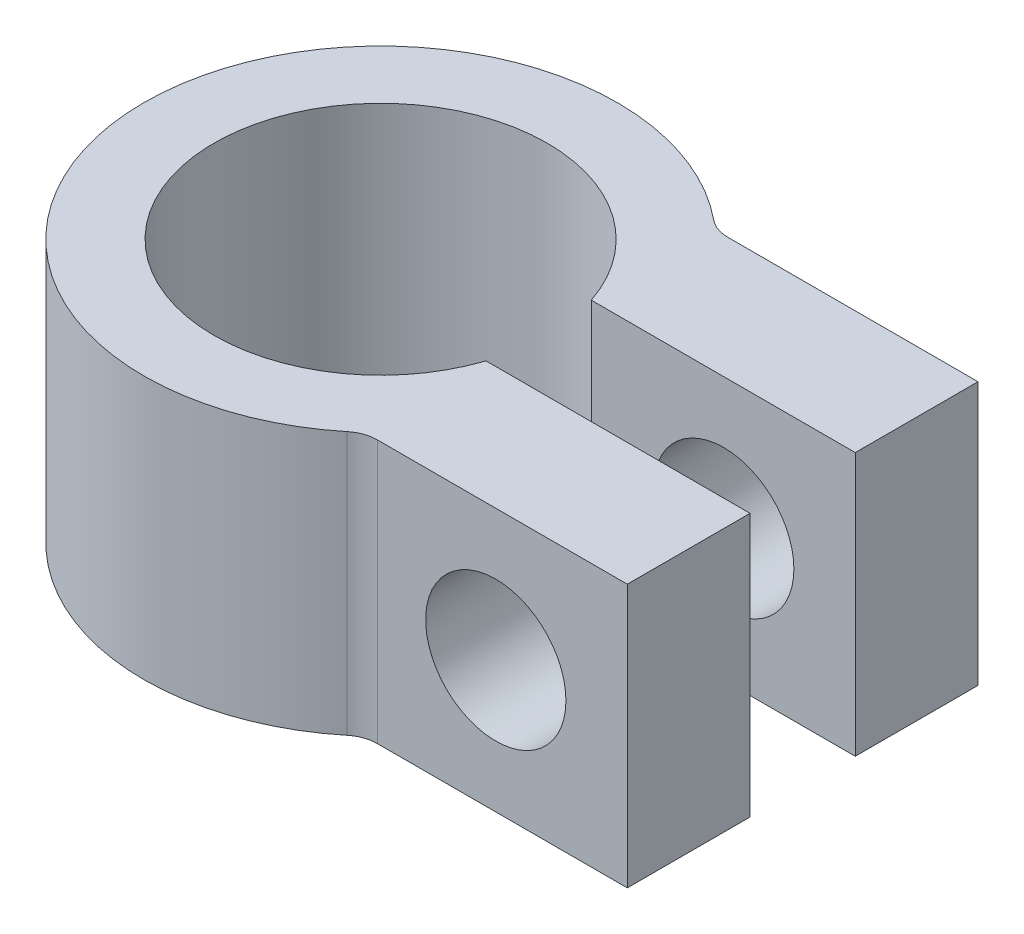
ISO-10303-21;
HEADER;
FILE_DESCRIPTION(('STEP AP214'),'2;1');
FILE_NAME('part.step','',(''),(''),'','','');
FILE_SCHEMA(('AUTOMOTIVE_DESIGN { 1 0 10303 214 1 1 1 1 }'));
ENDSEC;
DATA;
#1=APPLICATION_CONTEXT('core data for automotive mechanical design processes');
#2=APPLICATION_PROTOCOL_DEFINITION('international standard','automotive_design',2000,#1);
#3=PRODUCT_CONTEXT('',#1,'mechanical');
#4=PRODUCT('Part','Part','',(#3));
#5=PRODUCT_RELATED_PRODUCT_CATEGORY('part','',(#4));
#6=PRODUCT_DEFINITION_FORMATION('','',#4);
#7=PRODUCT_DEFINITION_CONTEXT('part definition',#1,'design');
#8=PRODUCT_DEFINITION('design','',#6,#7);
#9=PRODUCT_DEFINITION_SHAPE('','',#8);
#10=(LENGTH_UNIT() NAMED_UNIT(*) SI_UNIT(.MILLI.,.METRE.));
#11=(NAMED_UNIT(*) PLANE_ANGLE_UNIT() SI_UNIT($,.RADIAN.));
#12=(NAMED_UNIT(*) SI_UNIT($,.STERADIAN.) SOLID_ANGLE_UNIT());
#13=UNCERTAINTY_MEASURE_WITH_UNIT(LENGTH_MEASURE(1.E-05),#10,'distance_accuracy_value','');
#14=(GEOMETRIC_REPRESENTATION_CONTEXT(3) GLOBAL_UNCERTAINTY_ASSIGNED_CONTEXT((#13)) GLOBAL_UNIT_ASSIGNED_CONTEXT((#10,
#11,#12)) REPRESENTATION_CONTEXT('',''));
#15=CARTESIAN_POINT('',(0.,0.,0.));
#16=DIRECTION('',(0.,0.,1.));
#17=DIRECTION('',(1.,0.,0.));
#18=AXIS2_PLACEMENT_3D('',#15,#16,#17);
#19=CARTESIAN_POINT('',(0.,15.,0.));
#20=DIRECTION('',(0.,-1.,0.));
#21=DIRECTION('',(0.,0.,-1.));
#22=AXIS2_PLACEMENT_3D('',#19,#20,#21);
#23=CYLINDRICAL_SURFACE('',#22,13.5);
#24=CARTESIAN_POINT('',(0.,15.,0.));
#25=DIRECTION('',(0.,1.,0.));
#26=DIRECTION('',(0.,0.,1.));
#27=AXIS2_PLACEMENT_3D('',#24,#25,#26);
#28=CIRCLE('',#27,13.5);
#29=CARTESIAN_POINT('',(8.54481057257116,15.,-10.4516129032258));
#30=VERTEX_POINT('',#29);
#31=CARTESIAN_POINT('',(8.54481057257116,15.,10.4516129032258));
#32=VERTEX_POINT('',#31);
#33=EDGE_CURVE('E138',#30,#32,#28,.T.);
#34=ORIENTED_EDGE('',*,*,#33,.F.);
#35=DIRECTION('',(0.,-1.,0.));
#36=VECTOR('',#35,1.);
#37=CARTESIAN_POINT('',(8.54481057257116,15.,-10.4516129032258));
#38=LINE('',#37,#36);
#39=CARTESIAN_POINT('',(8.54481057257116,0.,-10.4516129032258));
#40=VERTEX_POINT('',#39);
#41=EDGE_CURVE('E163',#30,#40,#38,.T.);
#42=ORIENTED_EDGE('',*,*,#41,.T.);
#43=CARTESIAN_POINT('',(0.,0.,0.));
#44=DIRECTION('',(0.,1.,0.));
#45=DIRECTION('',(0.,0.,1.));
#46=AXIS2_PLACEMENT_3D('',#43,#44,#45);
#47=CIRCLE('',#46,13.5);
#48=CARTESIAN_POINT('',(8.54481057257116,0.,10.4516129032258));
#49=VERTEX_POINT('',#48);
#50=EDGE_CURVE('E135',#40,#49,#47,.T.);
#51=ORIENTED_EDGE('',*,*,#50,.T.);
#52=DIRECTION('',(0.,-1.,0.));
#53=VECTOR('',#52,1.);
#54=CARTESIAN_POINT('',(8.54481057257116,15.,10.4516129032258));
#55=LINE('',#54,#53);
#56=EDGE_CURVE('E155',#49,#32,#55,.F.);
#57=ORIENTED_EDGE('',*,*,#56,.T.);
#58=EDGE_LOOP('',(#34,#42,#51,#57));
#59=FACE_BOUND('',#58,.T.);
#60=ADVANCED_FACE('F32',(#59),#23,.T.);
#61=CARTESIAN_POINT('',(0.,15.,0.));
#62=DIRECTION('',(0.,1.,0.));
#63=DIRECTION('',(0.,0.,1.));
#64=AXIS2_PLACEMENT_3D('',#61,#62,#63);
#65=PLANE('',#64);
#66=CARTESIAN_POINT('',(0.,15.,0.));
#67=DIRECTION('',(0.,1.,0.));
#68=DIRECTION('',(0.,0.,1.));
#69=AXIS2_PLACEMENT_3D('',#66,#67,#68);
#70=CIRCLE('',#69,9.5);
#71=CARTESIAN_POINT('',(9.01387818865997,15.,-3.));
#72=VERTEX_POINT('',#71);
#73=CARTESIAN_POINT('',(9.01387818865997,15.,3.));
#74=VERTEX_POINT('',#73);
#75=EDGE_CURVE('E113',#72,#74,#70,.T.);
#76=ORIENTED_EDGE('',*,*,#75,.F.);
#77=DIRECTION('',(1.,0.,0.));
#78=VECTOR('',#77,1.);
#79=CARTESIAN_POINT('',(24.0691785736085,15.,-3.));
#80=LINE('',#79,#78);
#81=CARTESIAN_POINT('',(24.0691785736085,15.,-3.));
#82=VERTEX_POINT('',#81);
#83=EDGE_CURVE('E197',#72,#82,#80,.T.);
#84=ORIENTED_EDGE('',*,*,#83,.T.);
#85=DIRECTION('',(0.,0.,-1.));
#86=VECTOR('',#85,1.);
#87=CARTESIAN_POINT('',(24.0691785736085,15.,-3.));
#88=LINE('',#87,#86);
#89=CARTESIAN_POINT('',(24.0691785736085,15.,-10.));
#90=VERTEX_POINT('',#89);
#91=EDGE_CURVE('E205',#82,#90,#88,.T.);
#92=ORIENTED_EDGE('',*,*,#91,.T.);
#93=DIRECTION('',(-1.,0.,0.));
#94=VECTOR('',#93,1.);
#95=CARTESIAN_POINT('',(9.06917857360853,15.,-10.));
#96=LINE('',#95,#94);
#97=CARTESIAN_POINT('',(9.81070843517429,15.,-10.));
#98=VERTEX_POINT('',#97);
#99=EDGE_CURVE('E140',#90,#98,#96,.T.);
#100=ORIENTED_EDGE('',*,*,#99,.T.);
#101=CARTESIAN_POINT('',(9.81070843517429,15.,-12.));
#102=DIRECTION('',(0.,1.,0.));
#103=DIRECTION('',(0.,0.,1.));
#104=AXIS2_PLACEMENT_3D('',#101,#102,#103);
#105=CIRCLE('',#104,2.);
#106=EDGE_CURVE('E11',#98,#30,#105,.F.);
#107=ORIENTED_EDGE('',*,*,#106,.T.);
#108=ORIENTED_EDGE('',*,*,#33,.T.);
#109=CARTESIAN_POINT('',(9.81070843517429,15.,12.));
#110=DIRECTION('',(0.,1.,0.));
#111=DIRECTION('',(0.,0.,1.));
#112=AXIS2_PLACEMENT_3D('',#109,#110,#111);
#113=CIRCLE('',#112,2.);
#114=CARTESIAN_POINT('',(9.81070843517429,15.,10.));
#115=VERTEX_POINT('',#114);
#116=EDGE_CURVE('E161',#32,#115,#113,.F.);
#117=ORIENTED_EDGE('',*,*,#116,.T.);
#118=DIRECTION('',(-1.,0.,0.));
#119=VECTOR('',#118,1.);
#120=CARTESIAN_POINT('',(9.06917857360853,15.,10.));
#121=LINE('',#120,#119);
#122=CARTESIAN_POINT('',(24.0691785736085,15.,10.));
#123=VERTEX_POINT('',#122);
#124=EDGE_CURVE('E119',#123,#115,#121,.T.);
#125=ORIENTED_EDGE('',*,*,#124,.F.);
#126=DIRECTION('',(0.,0.,1.));
#127=VECTOR('',#126,1.);
#128=CARTESIAN_POINT('',(24.0691785736085,15.,3.));
#129=LINE('',#128,#127);
#130=CARTESIAN_POINT('',(24.0691785736085,15.,3.));
#131=VERTEX_POINT('',#130);
#132=EDGE_CURVE('E115',#131,#123,#129,.T.);
#133=ORIENTED_EDGE('',*,*,#132,.F.);
#134=DIRECTION('',(1.,0.,0.));
#135=VECTOR('',#134,1.);
#136=CARTESIAN_POINT('',(24.0691785736085,15.,3.));
#137=LINE('',#136,#135);
#138=EDGE_CURVE('E108',#74,#131,#137,.T.);
#139=ORIENTED_EDGE('',*,*,#138,.F.);
#140=EDGE_LOOP('',(#76,#84,#92,#100,#107,#108,#117,#125,#133,#139));
#141=FACE_BOUND('',#140,.T.);
#142=ADVANCED_FACE('F110',(#141),#65,.T.);
#143=CARTESIAN_POINT('',(0.,0.,0.));
#144=DIRECTION('',(0.,1.,0.));
#145=DIRECTION('',(0.,0.,1.));
#146=AXIS2_PLACEMENT_3D('',#143,#144,#145);
#147=PLANE('',#146);
#148=DIRECTION('',(1.,0.,0.));
#149=VECTOR('',#148,1.);
#150=CARTESIAN_POINT('',(24.0691785736085,0.,-3.));
#151=LINE('',#150,#149);
#152=CARTESIAN_POINT('',(9.01387818865997,0.,-3.));
#153=VERTEX_POINT('',#152);
#154=CARTESIAN_POINT('',(24.0691785736085,0.,-3.));
#155=VERTEX_POINT('',#154);
#156=EDGE_CURVE('E194',#153,#155,#151,.T.);
#157=ORIENTED_EDGE('',*,*,#156,.F.);
#158=CARTESIAN_POINT('',(0.,0.,0.));
#159=DIRECTION('',(0.,1.,0.));
#160=DIRECTION('',(0.,0.,1.));
#161=AXIS2_PLACEMENT_3D('',#158,#159,#160);
#162=CIRCLE('',#161,9.5);
#163=CARTESIAN_POINT('',(9.01387818865997,0.,3.));
#164=VERTEX_POINT('',#163);
#165=EDGE_CURVE('E136',#153,#164,#162,.T.);
#166=ORIENTED_EDGE('',*,*,#165,.T.);
#167=DIRECTION('',(1.,0.,0.));
#168=VECTOR('',#167,1.);
#169=CARTESIAN_POINT('',(24.0691785736085,0.,3.));
#170=LINE('',#169,#168);
#171=CARTESIAN_POINT('',(24.0691785736085,0.,3.));
#172=VERTEX_POINT('',#171);
#173=EDGE_CURVE('E125',#164,#172,#170,.T.);
#174=ORIENTED_EDGE('',*,*,#173,.T.);
#175=DIRECTION('',(0.,0.,1.));
#176=VECTOR('',#175,1.);
#177=CARTESIAN_POINT('',(24.0691785736085,0.,3.));
#178=LINE('',#177,#176);
#179=CARTESIAN_POINT('',(24.0691785736085,0.,10.));
#180=VERTEX_POINT('',#179);
#181=EDGE_CURVE('E190',#172,#180,#178,.T.);
#182=ORIENTED_EDGE('',*,*,#181,.T.);
#183=DIRECTION('',(-1.,0.,0.));
#184=VECTOR('',#183,1.);
#185=CARTESIAN_POINT('',(9.06917857360853,0.,10.));
#186=LINE('',#185,#184);
#187=CARTESIAN_POINT('',(9.81070843517429,0.,10.));
#188=VERTEX_POINT('',#187);
#189=EDGE_CURVE('E176',#180,#188,#186,.T.);
#190=ORIENTED_EDGE('',*,*,#189,.T.);
#191=CARTESIAN_POINT('',(9.81070843517429,0.,12.));
#192=DIRECTION('',(0.,1.,0.));
#193=DIRECTION('',(0.,0.,1.));
#194=AXIS2_PLACEMENT_3D('',#191,#192,#193);
#195=CIRCLE('',#194,2.);
#196=EDGE_CURVE('E158',#188,#49,#195,.T.);
#197=ORIENTED_EDGE('',*,*,#196,.T.);
#198=ORIENTED_EDGE('',*,*,#50,.F.);
#199=CARTESIAN_POINT('',(9.81070843517429,0.,-12.));
#200=DIRECTION('',(0.,1.,0.));
#201=DIRECTION('',(0.,0.,1.));
#202=AXIS2_PLACEMENT_3D('',#199,#200,#201);
#203=CIRCLE('',#202,2.);
#204=CARTESIAN_POINT('',(9.81070843517429,0.,-10.));
#205=VERTEX_POINT('',#204);
#206=EDGE_CURVE('E40',#40,#205,#203,.T.);
#207=ORIENTED_EDGE('',*,*,#206,.T.);
#208=DIRECTION('',(-1.,0.,0.));
#209=VECTOR('',#208,1.);
#210=CARTESIAN_POINT('',(9.06917857360853,0.,-10.));
#211=LINE('',#210,#209);
#212=CARTESIAN_POINT('',(24.0691785736085,0.,-10.));
#213=VERTEX_POINT('',#212);
#214=EDGE_CURVE('E198',#213,#205,#211,.T.);
#215=ORIENTED_EDGE('',*,*,#214,.F.);
#216=DIRECTION('',(0.,0.,-1.));
#217=VECTOR('',#216,1.);
#218=CARTESIAN_POINT('',(24.0691785736085,0.,-3.));
#219=LINE('',#218,#217);
#220=EDGE_CURVE('E201',#155,#213,#219,.T.);
#221=ORIENTED_EDGE('',*,*,#220,.F.);
#222=EDGE_LOOP('',(#157,#166,#174,#182,#190,#197,#198,#207,#215,#221));
#223=FACE_BOUND('',#222,.T.);
#224=ADVANCED_FACE('F171',(#223),#147,.F.);
#225=CARTESIAN_POINT('',(0.,15.,0.));
#226=DIRECTION('',(0.,-1.,0.));
#227=DIRECTION('',(0.,0.,-1.));
#228=AXIS2_PLACEMENT_3D('',#225,#226,#227);
#229=CYLINDRICAL_SURFACE('',#228,9.5);
#230=DIRECTION('',(0.,-1.,0.));
#231=VECTOR('',#230,1.);
#232=CARTESIAN_POINT('',(9.01387818865997,15.,-3.));
#233=LINE('',#232,#231);
#234=EDGE_CURVE('E129',#72,#153,#233,.T.);
#235=ORIENTED_EDGE('',*,*,#234,.F.);
#236=ORIENTED_EDGE('',*,*,#75,.T.);
#237=DIRECTION('',(0.,-1.,0.));
#238=VECTOR('',#237,1.);
#239=CARTESIAN_POINT('',(9.01387818865997,15.,3.));
#240=LINE('',#239,#238);
#241=EDGE_CURVE('E122',#164,#74,#240,.F.);
#242=ORIENTED_EDGE('',*,*,#241,.F.);
#243=ORIENTED_EDGE('',*,*,#165,.F.);
#244=EDGE_LOOP('',(#235,#236,#242,#243));
#245=FACE_BOUND('',#244,.T.);
#246=ADVANCED_FACE('F133',(#245),#229,.F.);
#247=CARTESIAN_POINT('',(24.0691785736085,31.5529453572468,-3.));
#248=DIRECTION('',(-1.,0.,0.));
#249=DIRECTION('',(0.,0.,1.));
#250=AXIS2_PLACEMENT_3D('',#247,#248,#249);
#251=PLANE('',#250);
#252=ORIENTED_EDGE('',*,*,#91,.F.);
#253=DIRECTION('',(0.,-1.,0.));
#254=VECTOR('',#253,1.);
#255=CARTESIAN_POINT('',(24.0691785736085,31.5529453572468,-3.));
#256=LINE('',#255,#254);
#257=EDGE_CURVE('E143',#82,#155,#256,.T.);
#258=ORIENTED_EDGE('',*,*,#257,.T.);
#259=ORIENTED_EDGE('',*,*,#220,.T.);
#260=DIRECTION('',(0.,-1.,0.));
#261=VECTOR('',#260,1.);
#262=CARTESIAN_POINT('',(24.0691785736085,31.5529453572468,-10.));
#263=LINE('',#262,#261);
#264=EDGE_CURVE('E200',#90,#213,#263,.T.);
#265=ORIENTED_EDGE('',*,*,#264,.F.);
#266=EDGE_LOOP('',(#252,#258,#259,#265));
#267=FACE_BOUND('',#266,.T.);
#268=ADVANCED_FACE('F213',(#267),#251,.F.);
#269=CARTESIAN_POINT('',(9.06917857360853,31.5529453572468,-10.));
#270=DIRECTION('',(0.,0.,1.));
#271=DIRECTION('',(1.,0.,0.));
#272=AXIS2_PLACEMENT_3D('',#269,#270,#271);
#273=PLANE('',#272);
#274=CARTESIAN_POINT('',(16.5691785736085,7.5,-10.));
#275=DIRECTION('',(0.,0.,1.));
#276=DIRECTION('',(1.,0.,0.));
#277=AXIS2_PLACEMENT_3D('',#274,#275,#276);
#278=CIRCLE('',#277,4.);
#279=CARTESIAN_POINT('',(20.5691785736085,7.5,-10.));
#280=VERTEX_POINT('',#279);
#281=EDGE_CURVE('E130',#280,#280,#278,.T.);
#282=ORIENTED_EDGE('',*,*,#281,.T.);
#283=EDGE_LOOP('',(#282));
#284=FACE_BOUND('',#283,.T.);
#285=ORIENTED_EDGE('',*,*,#214,.T.);
#286=DIRECTION('',(0.,1.,0.));
#287=VECTOR('',#286,1.);
#288=CARTESIAN_POINT('',(9.81070843517429,15.,-10.));
#289=LINE('',#288,#287);
#290=EDGE_CURVE('E53',#205,#98,#289,.T.);
#291=ORIENTED_EDGE('',*,*,#290,.T.);
#292=ORIENTED_EDGE('',*,*,#99,.F.);
#293=ORIENTED_EDGE('',*,*,#264,.T.);
#294=EDGE_LOOP('',(#285,#291,#292,#293));
#295=FACE_BOUND('',#294,.T.);
#296=ADVANCED_FACE('F209',(#284,#295),#273,.F.);
#297=CARTESIAN_POINT('',(24.0691785736085,31.5529453572468,-3.));
#298=DIRECTION('',(0.,0.,-1.));
#299=DIRECTION('',(-1.,0.,0.));
#300=AXIS2_PLACEMENT_3D('',#297,#298,#299);
#301=PLANE('',#300);
#302=CARTESIAN_POINT('',(16.5691785736085,7.5,-3.));
#303=DIRECTION('',(0.,0.,-1.));
#304=DIRECTION('',(-1.,0.,0.));
#305=AXIS2_PLACEMENT_3D('',#302,#303,#304);
#306=CIRCLE('',#305,4.);
#307=CARTESIAN_POINT('',(12.5691785736085,7.5,-3.));
#308=VERTEX_POINT('',#307);
#309=EDGE_CURVE('E151',#308,#308,#306,.T.);
#310=ORIENTED_EDGE('',*,*,#309,.T.);
#311=EDGE_LOOP('',(#310));
#312=FACE_BOUND('',#311,.T.);
#313=ORIENTED_EDGE('',*,*,#83,.F.);
#314=ORIENTED_EDGE('',*,*,#234,.T.);
#315=ORIENTED_EDGE('',*,*,#156,.T.);
#316=ORIENTED_EDGE('',*,*,#257,.F.);
#317=EDGE_LOOP('',(#313,#314,#315,#316));
#318=FACE_BOUND('',#317,.T.);
#319=ADVANCED_FACE('F215',(#312,#318),#301,.F.);
#320=CARTESIAN_POINT('',(9.06917857360853,31.5529453572468,10.));
#321=DIRECTION('',(0.,0.,1.));
#322=DIRECTION('',(1.,0.,0.));
#323=AXIS2_PLACEMENT_3D('',#320,#321,#322);
#324=PLANE('',#323);
#325=CARTESIAN_POINT('',(16.5691785736085,7.5,10.));
#326=DIRECTION('',(0.,0.,1.));
#327=DIRECTION('',(1.,0.,0.));
#328=AXIS2_PLACEMENT_3D('',#325,#326,#327);
#329=CIRCLE('',#328,4.);
#330=CARTESIAN_POINT('',(20.5691785736085,7.5,10.));
#331=VERTEX_POINT('',#330);
#332=EDGE_CURVE('E152',#331,#331,#329,.T.);
#333=ORIENTED_EDGE('',*,*,#332,.F.);
#334=EDGE_LOOP('',(#333));
#335=FACE_BOUND('',#334,.T.);
#336=ORIENTED_EDGE('',*,*,#124,.T.);
#337=DIRECTION('',(0.,-1.,0.));
#338=VECTOR('',#337,1.);
#339=CARTESIAN_POINT('',(9.81070843517429,31.5529453572468,10.));
#340=LINE('',#339,#338);
#341=EDGE_CURVE('E146',#115,#188,#340,.T.);
#342=ORIENTED_EDGE('',*,*,#341,.T.);
#343=ORIENTED_EDGE('',*,*,#189,.F.);
#344=DIRECTION('',(0.,-1.,0.));
#345=VECTOR('',#344,1.);
#346=CARTESIAN_POINT('',(24.0691785736085,31.5529453572468,10.));
#347=LINE('',#346,#345);
#348=EDGE_CURVE('E185',#123,#180,#347,.T.);
#349=ORIENTED_EDGE('',*,*,#348,.F.);
#350=EDGE_LOOP('',(#336,#342,#343,#349));
#351=FACE_BOUND('',#350,.T.);
#352=ADVANCED_FACE('F184',(#335,#351),#324,.T.);
#353=CARTESIAN_POINT('',(24.0691785736085,31.5529453572468,3.));
#354=DIRECTION('',(0.,0.,-1.));
#355=DIRECTION('',(-1.,0.,0.));
#356=AXIS2_PLACEMENT_3D('',#353,#354,#355);
#357=PLANE('',#356);
#358=CARTESIAN_POINT('',(16.5691785736085,7.5,3.));
#359=DIRECTION('',(0.,0.,-1.));
#360=DIRECTION('',(-1.,0.,0.));
#361=AXIS2_PLACEMENT_3D('',#358,#359,#360);
#362=CIRCLE('',#361,4.);
#363=CARTESIAN_POINT('',(12.5691785736085,7.5,3.));
#364=VERTEX_POINT('',#363);
#365=EDGE_CURVE('E148',#364,#364,#362,.T.);
#366=ORIENTED_EDGE('',*,*,#365,.F.);
#367=EDGE_LOOP('',(#366));
#368=FACE_BOUND('',#367,.T.);
#369=ORIENTED_EDGE('',*,*,#173,.F.);
#370=ORIENTED_EDGE('',*,*,#241,.T.);
#371=ORIENTED_EDGE('',*,*,#138,.T.);
#372=DIRECTION('',(0.,-1.,0.));
#373=VECTOR('',#372,1.);
#374=CARTESIAN_POINT('',(24.0691785736085,31.5529453572468,3.));
#375=LINE('',#374,#373);
#376=EDGE_CURVE('E118',#131,#172,#375,.T.);
#377=ORIENTED_EDGE('',*,*,#376,.T.);
#378=EDGE_LOOP('',(#369,#370,#371,#377));
#379=FACE_BOUND('',#378,.T.);
#380=ADVANCED_FACE('F123',(#368,#379),#357,.T.);
#381=CARTESIAN_POINT('',(24.0691785736085,31.5529453572468,3.));
#382=DIRECTION('',(1.,0.,0.));
#383=DIRECTION('',(0.,0.,-1.));
#384=AXIS2_PLACEMENT_3D('',#381,#382,#383);
#385=PLANE('',#384);
#386=ORIENTED_EDGE('',*,*,#376,.F.);
#387=ORIENTED_EDGE('',*,*,#132,.T.);
#388=ORIENTED_EDGE('',*,*,#348,.T.);
#389=ORIENTED_EDGE('',*,*,#181,.F.);
#390=EDGE_LOOP('',(#386,#387,#388,#389));
#391=FACE_BOUND('',#390,.T.);
#392=ADVANCED_FACE('F236',(#391),#385,.T.);
#393=CARTESIAN_POINT('',(16.5691785736085,7.5,-13.5));
#394=DIRECTION('',(0.,0.,1.));
#395=DIRECTION('',(1.,0.,0.));
#396=AXIS2_PLACEMENT_3D('',#393,#394,#395);
#397=CYLINDRICAL_SURFACE('',#396,4.);
#398=ORIENTED_EDGE('',*,*,#365,.T.);
#399=EDGE_LOOP('',(#398));
#400=FACE_BOUND('',#399,.T.);
#401=ORIENTED_EDGE('',*,*,#332,.T.);
#402=EDGE_LOOP('',(#401));
#403=FACE_BOUND('',#402,.T.);
#404=ADVANCED_FACE('F228',(#400,#403),#397,.F.);
#405=ORIENTED_EDGE('',*,*,#309,.F.);
#406=EDGE_LOOP('',(#405));
#407=FACE_BOUND('',#406,.T.);
#408=ORIENTED_EDGE('',*,*,#281,.F.);
#409=EDGE_LOOP('',(#408));
#410=FACE_BOUND('',#409,.T.);
#411=ADVANCED_FACE('F249',(#407,#410),#397,.F.);
#412=CARTESIAN_POINT('',(9.81070843517429,15.,12.));
#413=DIRECTION('',(0.,-1.,0.));
#414=DIRECTION('',(0.,0.,-1.));
#415=AXIS2_PLACEMENT_3D('',#412,#413,#414);
#416=CYLINDRICAL_SURFACE('',#415,2.);
#417=ORIENTED_EDGE('',*,*,#116,.F.);
#418=ORIENTED_EDGE('',*,*,#56,.F.);
#419=ORIENTED_EDGE('',*,*,#196,.F.);
#420=ORIENTED_EDGE('',*,*,#341,.F.);
#421=EDGE_LOOP('',(#417,#418,#419,#420));
#422=FACE_BOUND('',#421,.T.);
#423=ADVANCED_FACE('F180',(#422),#416,.F.);
#424=CARTESIAN_POINT('',(9.81070843517429,15.,-12.));
#425=DIRECTION('',(0.,-1.,0.));
#426=DIRECTION('',(0.,0.,-1.));
#427=AXIS2_PLACEMENT_3D('',#424,#425,#426);
#428=CYLINDRICAL_SURFACE('',#427,2.);
#429=ORIENTED_EDGE('',*,*,#106,.F.);
#430=ORIENTED_EDGE('',*,*,#290,.F.);
#431=ORIENTED_EDGE('',*,*,#206,.F.);
#432=ORIENTED_EDGE('',*,*,#41,.F.);
#433=EDGE_LOOP('',(#429,#430,#431,#432));
#434=FACE_BOUND('',#433,.T.);
#435=ADVANCED_FACE('F34',(#434),#428,.F.);
#436=CLOSED_SHELL('',(#60,#142,#224,#246,#268,#296,#319,#352,#380,#392,#404,#411,#423,#435));
#437=MANIFOLD_SOLID_BREP('B2',#436);
#438=ADVANCED_BREP_SHAPE_REPRESENTATION('',(#18,#437),#14);
#439=SHAPE_DEFINITION_REPRESENTATION(#9,#438);
ENDSEC;
END-ISO-10303-21;
